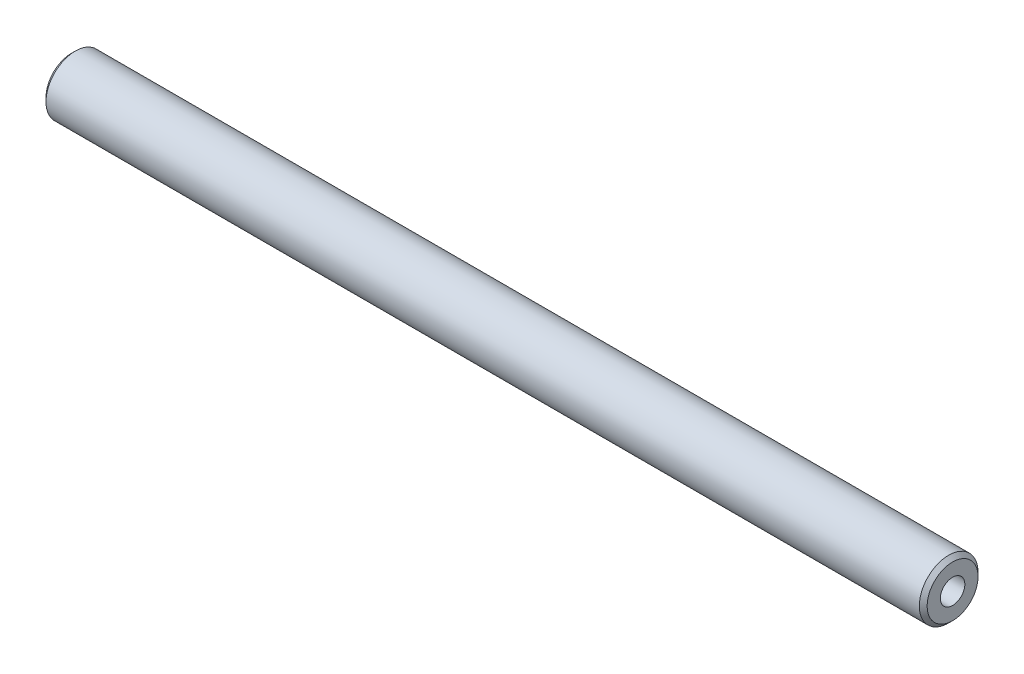
ISO-10303-21;
HEADER;
FILE_DESCRIPTION(('STEP AP214'),'2;1');
FILE_NAME('part.step','',(''),(''),'','','');
FILE_SCHEMA(('AUTOMOTIVE_DESIGN { 1 0 10303 214 1 1 1 1 }'));
ENDSEC;
DATA;
#1=APPLICATION_CONTEXT('core data for automotive mechanical design processes');
#2=APPLICATION_PROTOCOL_DEFINITION('international standard','automotive_design',2000,#1);
#3=PRODUCT_CONTEXT('',#1,'mechanical');
#4=PRODUCT('Part','Part','',(#3));
#5=PRODUCT_RELATED_PRODUCT_CATEGORY('part','',(#4));
#6=PRODUCT_DEFINITION_FORMATION('','',#4);
#7=PRODUCT_DEFINITION_CONTEXT('part definition',#1,'design');
#8=PRODUCT_DEFINITION('design','',#6,#7);
#9=PRODUCT_DEFINITION_SHAPE('','',#8);
#10=(LENGTH_UNIT() NAMED_UNIT(*) SI_UNIT(.MILLI.,.METRE.));
#11=(NAMED_UNIT(*) PLANE_ANGLE_UNIT() SI_UNIT($,.RADIAN.));
#12=(NAMED_UNIT(*) SI_UNIT($,.STERADIAN.) SOLID_ANGLE_UNIT());
#13=UNCERTAINTY_MEASURE_WITH_UNIT(LENGTH_MEASURE(1.E-05),#10,'distance_accuracy_value','');
#14=(GEOMETRIC_REPRESENTATION_CONTEXT(3) GLOBAL_UNCERTAINTY_ASSIGNED_CONTEXT((#13)) GLOBAL_UNIT_ASSIGNED_CONTEXT((#10,
#11,#12)) REPRESENTATION_CONTEXT('',''));
#15=CARTESIAN_POINT('',(0.,0.,0.));
#16=DIRECTION('',(0.,0.,1.));
#17=DIRECTION('',(1.,0.,0.));
#18=AXIS2_PLACEMENT_3D('',#15,#16,#17);
#19=CARTESIAN_POINT('',(0.,3.,0.));
#20=DIRECTION('',(1.,0.,0.));
#21=DIRECTION('',(0.,0.,-1.));
#22=AXIS2_PLACEMENT_3D('',#19,#20,#21);
#23=PLANE('',#22);
#24=CARTESIAN_POINT('',(0.,0.,0.));
#25=DIRECTION('',(-1.,0.,0.));
#26=DIRECTION('',(0.,0.,1.));
#27=AXIS2_PLACEMENT_3D('',#24,#25,#26);
#28=CIRCLE('',#27,1.25);
#29=CARTESIAN_POINT('',(0.,0.,1.25));
#30=VERTEX_POINT('',#29);
#31=EDGE_CURVE('E72',#30,#30,#28,.T.);
#32=ORIENTED_EDGE('',*,*,#31,.F.);
#33=EDGE_LOOP('',(#32));
#34=FACE_BOUND('',#33,.T.);
#35=CARTESIAN_POINT('',(0.,0.,0.));
#36=DIRECTION('',(1.,0.,0.));
#37=DIRECTION('',(0.,0.,-1.));
#38=AXIS2_PLACEMENT_3D('',#35,#36,#37);
#39=CIRCLE('',#38,2.59999999999998);
#40=CARTESIAN_POINT('',(0.,0.,-2.59999999999998));
#41=VERTEX_POINT('',#40);
#42=EDGE_CURVE('E11',#41,#41,#39,.F.);
#43=ORIENTED_EDGE('',*,*,#42,.T.);
#44=EDGE_LOOP('',(#43));
#45=FACE_BOUND('',#44,.T.);
#46=ADVANCED_FACE('F46',(#34,#45),#23,.F.);
#47=CARTESIAN_POINT('',(90.,3.,0.));
#48=DIRECTION('',(-1.,0.,0.));
#49=DIRECTION('',(0.,0.,1.));
#50=AXIS2_PLACEMENT_3D('',#47,#48,#49);
#51=PLANE('',#50);
#52=CARTESIAN_POINT('',(90.,0.,0.));
#53=DIRECTION('',(1.,0.,0.));
#54=DIRECTION('',(0.,0.,-1.));
#55=AXIS2_PLACEMENT_3D('',#52,#53,#54);
#56=CIRCLE('',#55,1.25);
#57=CARTESIAN_POINT('',(90.,0.,-1.25));
#58=VERTEX_POINT('',#57);
#59=EDGE_CURVE('E69',#58,#58,#56,.T.);
#60=ORIENTED_EDGE('',*,*,#59,.F.);
#61=EDGE_LOOP('',(#60));
#62=FACE_BOUND('',#61,.T.);
#63=CARTESIAN_POINT('',(90.,0.,0.));
#64=DIRECTION('',(-1.,0.,0.));
#65=DIRECTION('',(0.,0.,1.));
#66=AXIS2_PLACEMENT_3D('',#63,#64,#65);
#67=CIRCLE('',#66,2.59999999999998);
#68=CARTESIAN_POINT('',(90.,0.,2.59999999999998));
#69=VERTEX_POINT('',#68);
#70=EDGE_CURVE('E54',#69,#69,#67,.F.);
#71=ORIENTED_EDGE('',*,*,#70,.T.);
#72=EDGE_LOOP('',(#71));
#73=FACE_BOUND('',#72,.T.);
#74=ADVANCED_FACE('F88',(#62,#73),#51,.F.);
#75=CARTESIAN_POINT('',(0.,0.,0.));
#76=DIRECTION('',(-1.,0.,0.));
#77=DIRECTION('',(0.,0.,1.));
#78=AXIS2_PLACEMENT_3D('',#75,#76,#77);
#79=CYLINDRICAL_SURFACE('',#78,3.);
#80=CARTESIAN_POINT('',(89.6,0.,0.));
#81=DIRECTION('',(-1.,0.,0.));
#82=DIRECTION('',(0.,0.,1.));
#83=AXIS2_PLACEMENT_3D('',#80,#81,#82);
#84=CIRCLE('',#83,3.);
#85=CARTESIAN_POINT('',(89.6,0.,3.));
#86=VERTEX_POINT('',#85);
#87=EDGE_CURVE('E83',#86,#86,#84,.T.);
#88=ORIENTED_EDGE('',*,*,#87,.T.);
#89=EDGE_LOOP('',(#88));
#90=FACE_BOUND('',#89,.T.);
#91=CARTESIAN_POINT('',(0.400000000000018,0.,0.));
#92=DIRECTION('',(1.,0.,0.));
#93=DIRECTION('',(0.,0.,-1.));
#94=AXIS2_PLACEMENT_3D('',#91,#92,#93);
#95=CIRCLE('',#94,3.);
#96=CARTESIAN_POINT('',(0.400000000000018,0.,-3.));
#97=VERTEX_POINT('',#96);
#98=EDGE_CURVE('E80',#97,#97,#95,.T.);
#99=ORIENTED_EDGE('',*,*,#98,.T.);
#100=EDGE_LOOP('',(#99));
#101=FACE_BOUND('',#100,.T.);
#102=ADVANCED_FACE('F93',(#90,#101),#79,.T.);
#103=CARTESIAN_POINT('',(89.6,0.,0.));
#104=DIRECTION('',(-1.,0.,0.));
#105=DIRECTION('',(0.,0.,1.));
#106=AXIS2_PLACEMENT_3D('',#103,#104,#105);
#107=CONICAL_SURFACE('',#106,3.,0.785398163397437);
#108=ORIENTED_EDGE('',*,*,#70,.F.);
#109=EDGE_LOOP('',(#108));
#110=FACE_BOUND('',#109,.T.);
#111=ORIENTED_EDGE('',*,*,#87,.F.);
#112=EDGE_LOOP('',(#111));
#113=FACE_BOUND('',#112,.T.);
#114=ADVANCED_FACE('F90',(#110,#113),#107,.T.);
#115=CARTESIAN_POINT('',(0.,0.,0.));
#116=DIRECTION('',(1.,0.,0.));
#117=DIRECTION('',(0.,0.,-1.));
#118=AXIS2_PLACEMENT_3D('',#115,#116,#117);
#119=CONICAL_SURFACE('',#118,2.59999999999998,0.785398163397454);
#120=ORIENTED_EDGE('',*,*,#98,.F.);
#121=EDGE_LOOP('',(#120));
#122=FACE_BOUND('',#121,.T.);
#123=ORIENTED_EDGE('',*,*,#42,.F.);
#124=EDGE_LOOP('',(#123));
#125=FACE_BOUND('',#124,.T.);
#126=ADVANCED_FACE('F48',(#122,#125),#119,.T.);
#127=CARTESIAN_POINT('',(8.5,0.,0.));
#128=DIRECTION('',(-1.,0.,0.));
#129=DIRECTION('',(0.,0.,1.));
#130=AXIS2_PLACEMENT_3D('',#127,#128,#129);
#131=CONICAL_SURFACE('',#130,1.25,1.02974425867666);
#132=CARTESIAN_POINT('',(9.25107577378445,0.,0.));
#133=VERTEX_POINT('',#132);
#134=VERTEX_LOOP('',#133);
#135=FACE_BOUND('',#134,.T.);
#136=CARTESIAN_POINT('',(8.5,0.,0.));
#137=DIRECTION('',(-1.,0.,0.));
#138=DIRECTION('',(0.,0.,1.));
#139=AXIS2_PLACEMENT_3D('',#136,#137,#138);
#140=CIRCLE('',#139,1.25);
#141=CARTESIAN_POINT('',(8.5,0.,1.25));
#142=VERTEX_POINT('',#141);
#143=EDGE_CURVE('E77',#142,#142,#140,.T.);
#144=ORIENTED_EDGE('',*,*,#143,.T.);
#145=EDGE_LOOP('',(#144));
#146=FACE_BOUND('',#145,.T.);
#147=ADVANCED_FACE('F103',(#135,#146),#131,.F.);
#148=CARTESIAN_POINT('',(0.,0.,0.));
#149=DIRECTION('',(-1.,0.,0.));
#150=DIRECTION('',(0.,0.,1.));
#151=AXIS2_PLACEMENT_3D('',#148,#149,#150);
#152=CYLINDRICAL_SURFACE('',#151,1.25);
#153=ORIENTED_EDGE('',*,*,#143,.F.);
#154=EDGE_LOOP('',(#153));
#155=FACE_BOUND('',#154,.T.);
#156=ORIENTED_EDGE('',*,*,#31,.T.);
#157=EDGE_LOOP('',(#156));
#158=FACE_BOUND('',#157,.T.);
#159=ADVANCED_FACE('F118',(#155,#158),#152,.F.);
#160=CARTESIAN_POINT('',(90.,0.,0.));
#161=DIRECTION('',(1.,0.,0.));
#162=DIRECTION('',(0.,0.,-1.));
#163=AXIS2_PLACEMENT_3D('',#160,#161,#162);
#164=CYLINDRICAL_SURFACE('',#163,1.25);
#165=CARTESIAN_POINT('',(81.5,0.,0.));
#166=DIRECTION('',(1.,0.,0.));
#167=DIRECTION('',(0.,0.,-1.));
#168=AXIS2_PLACEMENT_3D('',#165,#166,#167);
#169=CIRCLE('',#168,1.25);
#170=CARTESIAN_POINT('',(81.5,0.,-1.25));
#171=VERTEX_POINT('',#170);
#172=EDGE_CURVE('E67',#171,#171,#169,.T.);
#173=ORIENTED_EDGE('',*,*,#172,.F.);
#174=EDGE_LOOP('',(#173));
#175=FACE_BOUND('',#174,.T.);
#176=ORIENTED_EDGE('',*,*,#59,.T.);
#177=EDGE_LOOP('',(#176));
#178=FACE_BOUND('',#177,.T.);
#179=ADVANCED_FACE('F63',(#175,#178),#164,.F.);
#180=CARTESIAN_POINT('',(81.5,0.,0.));
#181=DIRECTION('',(1.,0.,0.));
#182=DIRECTION('',(0.,0.,-1.));
#183=AXIS2_PLACEMENT_3D('',#180,#181,#182);
#184=CONICAL_SURFACE('',#183,1.25,1.02974425867666);
#185=CARTESIAN_POINT('',(80.7489242262155,0.,0.));
#186=VERTEX_POINT('',#185);
#187=VERTEX_LOOP('',#186);
#188=FACE_BOUND('',#187,.T.);
#189=ORIENTED_EDGE('',*,*,#172,.T.);
#190=EDGE_LOOP('',(#189));
#191=FACE_BOUND('',#190,.T.);
#192=ADVANCED_FACE('F60',(#188,#191),#184,.F.);
#193=CLOSED_SHELL('',(#46,#74,#102,#114,#126,#147,#159,#179,#192));
#194=MANIFOLD_SOLID_BREP('B2',#193);
#195=ADVANCED_BREP_SHAPE_REPRESENTATION('',(#18,#194),#14);
#196=SHAPE_DEFINITION_REPRESENTATION(#9,#195);
ENDSEC;
END-ISO-10303-21;
